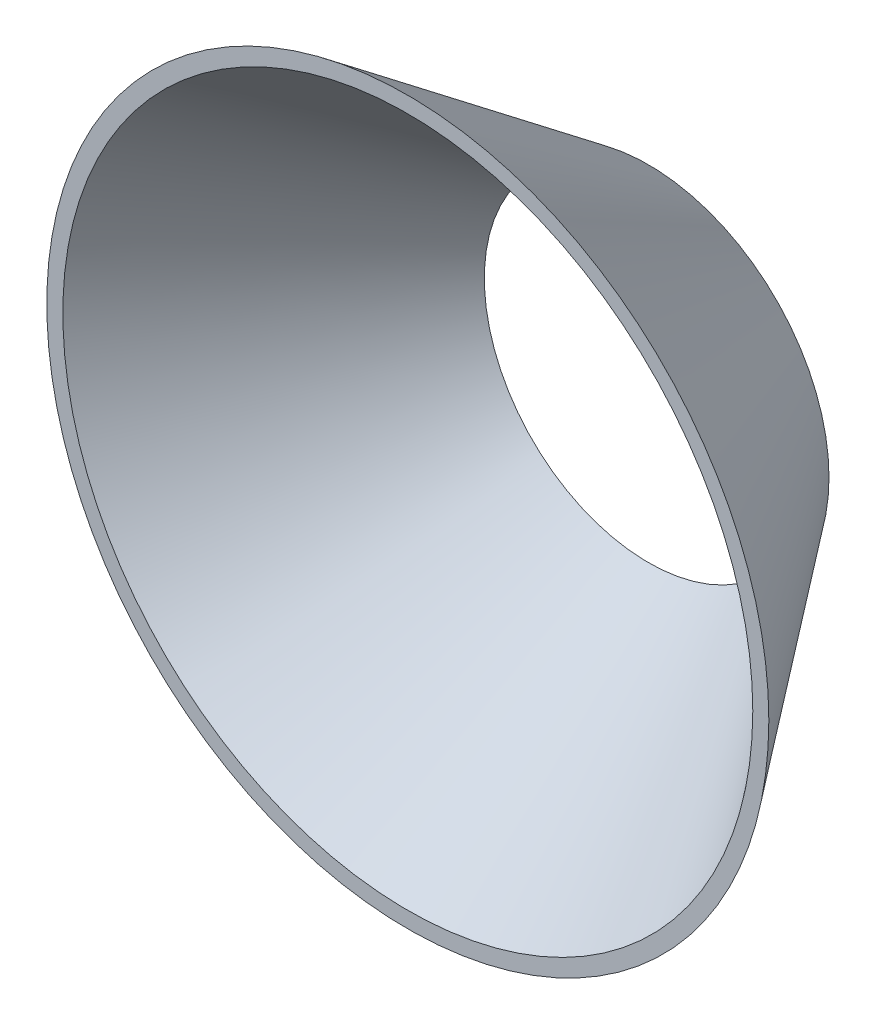
ISO-10303-21;
HEADER;
FILE_DESCRIPTION(('STEP AP214'),'2;1');
FILE_NAME('part.step','',(''),(''),'','','');
FILE_SCHEMA(('AUTOMOTIVE_DESIGN { 1 0 10303 214 1 1 1 1 }'));
ENDSEC;
DATA;
#1=APPLICATION_CONTEXT('core data for automotive mechanical design processes');
#2=APPLICATION_PROTOCOL_DEFINITION('international standard','automotive_design',2000,#1);
#3=PRODUCT_CONTEXT('',#1,'mechanical');
#4=PRODUCT('Part','Part','',(#3));
#5=PRODUCT_RELATED_PRODUCT_CATEGORY('part','',(#4));
#6=PRODUCT_DEFINITION_FORMATION('','',#4);
#7=PRODUCT_DEFINITION_CONTEXT('part definition',#1,'design');
#8=PRODUCT_DEFINITION('design','',#6,#7);
#9=PRODUCT_DEFINITION_SHAPE('','',#8);
#10=(LENGTH_UNIT() NAMED_UNIT(*) SI_UNIT(.MILLI.,.METRE.));
#11=(NAMED_UNIT(*) PLANE_ANGLE_UNIT() SI_UNIT($,.RADIAN.));
#12=(NAMED_UNIT(*) SI_UNIT($,.STERADIAN.) SOLID_ANGLE_UNIT());
#13=UNCERTAINTY_MEASURE_WITH_UNIT(LENGTH_MEASURE(1.E-05),#10,'distance_accuracy_value','');
#14=(GEOMETRIC_REPRESENTATION_CONTEXT(3) GLOBAL_UNCERTAINTY_ASSIGNED_CONTEXT((#13)) GLOBAL_UNIT_ASSIGNED_CONTEXT((#10,
#11,#12)) REPRESENTATION_CONTEXT('',''));
#15=CARTESIAN_POINT('',(0.,0.,0.));
#16=DIRECTION('',(0.,0.,1.));
#17=DIRECTION('',(1.,0.,0.));
#18=AXIS2_PLACEMENT_3D('',#15,#16,#17);
#19=CARTESIAN_POINT('',(0.,0.,-30.));
#20=DIRECTION('',(0.,0.,-1.));
#21=DIRECTION('',(-1.,0.,0.));
#22=AXIS2_PLACEMENT_3D('',#19,#20,#21);
#23=PLANE('',#22);
#24=CARTESIAN_POINT('',(0.,0.,-30.));
#25=DIRECTION('',(0.,0.,1.));
#26=DIRECTION('',(1.,0.,0.));
#27=AXIS2_PLACEMENT_3D('',#24,#25,#26);
#28=CIRCLE('',#27,20.4648455095012);
#29=CARTESIAN_POINT('',(20.4648455095012,0.,-30.));
#30=VERTEX_POINT('',#29);
#31=EDGE_CURVE('E47',#30,#30,#28,.T.);
#32=ORIENTED_EDGE('',*,*,#31,.T.);
#33=EDGE_LOOP('',(#32));
#34=FACE_BOUND('',#33,.T.);
#35=CARTESIAN_POINT('',(0.,0.,-30.));
#36=DIRECTION('',(0.,0.,1.));
#37=DIRECTION('',(1.,0.,0.));
#38=AXIS2_PLACEMENT_3D('',#35,#36,#37);
#39=CIRCLE('',#38,22.5);
#40=CARTESIAN_POINT('',(22.5,0.,-30.));
#41=VERTEX_POINT('',#40);
#42=EDGE_CURVE('E10',#41,#41,#39,.T.);
#43=ORIENTED_EDGE('',*,*,#42,.F.);
#44=EDGE_LOOP('',(#43));
#45=FACE_BOUND('',#44,.T.);
#46=ADVANCED_FACE('F33',(#34,#45),#23,.T.);
#47=CARTESIAN_POINT('',(0.,0.,-30.));
#48=DIRECTION('',(0.,0.,1.));
#49=DIRECTION('',(1.,0.,0.));
#50=AXIS2_PLACEMENT_3D('',#47,#48,#49);
#51=CONICAL_SURFACE('',#50,22.5,0.643501108793284);
#52=CARTESIAN_POINT('',(0.,0.,0.));
#53=DIRECTION('',(0.,0.,1.));
#54=DIRECTION('',(1.,0.,0.));
#55=AXIS2_PLACEMENT_3D('',#52,#53,#54);
#56=CIRCLE('',#55,45.);
#57=CARTESIAN_POINT('',(45.,0.,0.));
#58=VERTEX_POINT('',#57);
#59=EDGE_CURVE('E39',#58,#58,#56,.T.);
#60=ORIENTED_EDGE('',*,*,#59,.F.);
#61=EDGE_LOOP('',(#60));
#62=FACE_BOUND('',#61,.T.);
#63=ORIENTED_EDGE('',*,*,#42,.T.);
#64=EDGE_LOOP('',(#63));
#65=FACE_BOUND('',#64,.T.);
#66=ADVANCED_FACE('F63',(#62,#65),#51,.T.);
#67=CARTESIAN_POINT('',(0.,0.,0.));
#68=DIRECTION('',(0.,0.,-1.));
#69=DIRECTION('',(-1.,0.,0.));
#70=AXIS2_PLACEMENT_3D('',#67,#68,#69);
#71=PLANE('',#70);
#72=CARTESIAN_POINT('',(0.,0.,0.));
#73=DIRECTION('',(0.,0.,1.));
#74=DIRECTION('',(1.,0.,0.));
#75=AXIS2_PLACEMENT_3D('',#72,#73,#74);
#76=CIRCLE('',#75,43.);
#77=CARTESIAN_POINT('',(43.,0.,0.));
#78=VERTEX_POINT('',#77);
#79=EDGE_CURVE('E43',#78,#78,#76,.T.);
#80=ORIENTED_EDGE('',*,*,#79,.F.);
#81=EDGE_LOOP('',(#80));
#82=FACE_BOUND('',#81,.T.);
#83=ORIENTED_EDGE('',*,*,#59,.T.);
#84=EDGE_LOOP('',(#83));
#85=FACE_BOUND('',#84,.T.);
#86=ADVANCED_FACE('F58',(#82,#85),#71,.F.);
#87=CARTESIAN_POINT('',(0.,0.,0.));
#88=DIRECTION('',(0.,0.,1.));
#89=DIRECTION('',(1.,0.,0.));
#90=AXIS2_PLACEMENT_3D('',#87,#88,#89);
#91=CONICAL_SURFACE('',#90,43.,0.644250649521255);
#92=ORIENTED_EDGE('',*,*,#31,.F.);
#93=EDGE_LOOP('',(#92));
#94=FACE_BOUND('',#93,.T.);
#95=ORIENTED_EDGE('',*,*,#79,.T.);
#96=EDGE_LOOP('',(#95));
#97=FACE_BOUND('',#96,.T.);
#98=ADVANCED_FACE('F55',(#94,#97),#91,.F.);
#99=CLOSED_SHELL('',(#46,#66,#86,#98));
#100=MANIFOLD_SOLID_BREP('B2',#99);
#101=ADVANCED_BREP_SHAPE_REPRESENTATION('',(#18,#100),#14);
#102=SHAPE_DEFINITION_REPRESENTATION(#9,#101);
ENDSEC;
END-ISO-10303-21;
